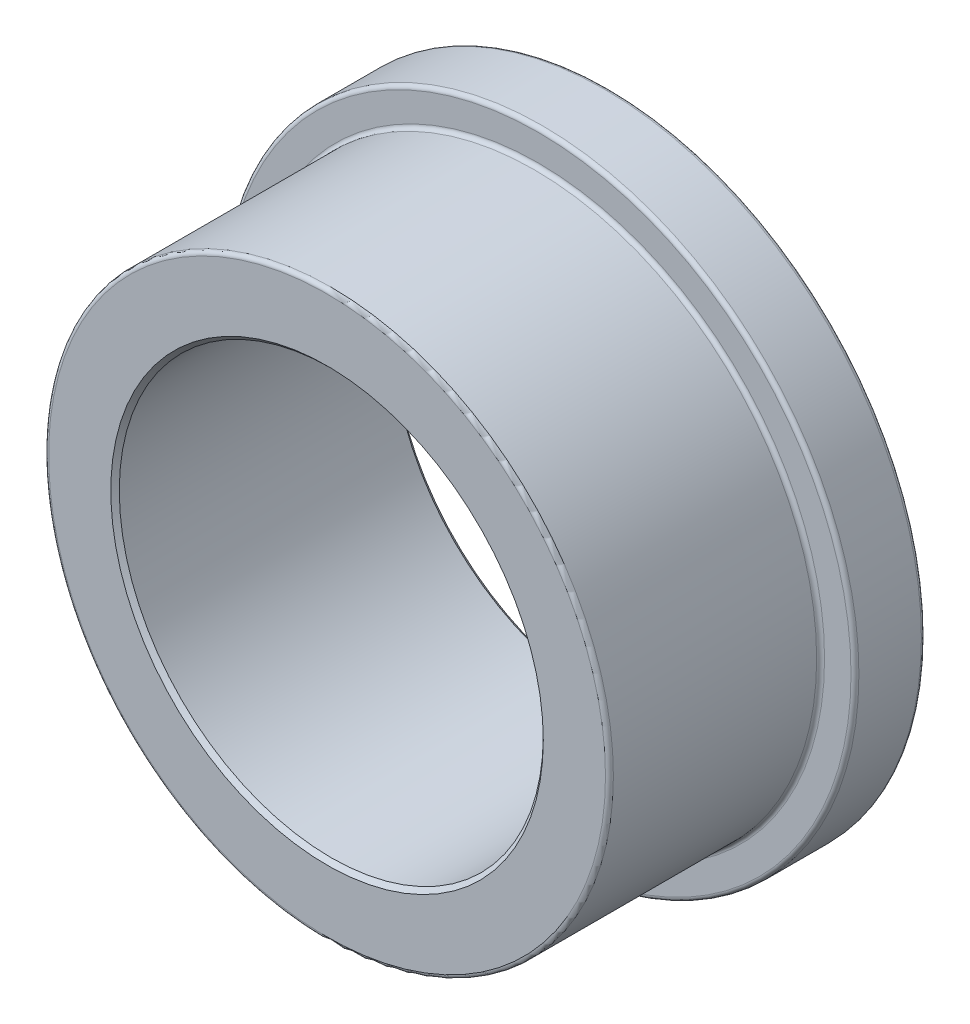
ISO-10303-21;
HEADER;
FILE_DESCRIPTION(('STEP AP214'),'2;1');
FILE_NAME('part.step','',(''),(''),'','','');
FILE_SCHEMA(('AUTOMOTIVE_DESIGN { 1 0 10303 214 1 1 1 1 }'));
ENDSEC;
DATA;
#1=APPLICATION_CONTEXT('core data for automotive mechanical design processes');
#2=APPLICATION_PROTOCOL_DEFINITION('international standard','automotive_design',2000,#1);
#3=PRODUCT_CONTEXT('',#1,'mechanical');
#4=PRODUCT('Part','Part','',(#3));
#5=PRODUCT_RELATED_PRODUCT_CATEGORY('part','',(#4));
#6=PRODUCT_DEFINITION_FORMATION('','',#4);
#7=PRODUCT_DEFINITION_CONTEXT('part definition',#1,'design');
#8=PRODUCT_DEFINITION('design','',#6,#7);
#9=PRODUCT_DEFINITION_SHAPE('','',#8);
#10=(LENGTH_UNIT() NAMED_UNIT(*) SI_UNIT(.MILLI.,.METRE.));
#11=(NAMED_UNIT(*) PLANE_ANGLE_UNIT() SI_UNIT($,.RADIAN.));
#12=(NAMED_UNIT(*) SI_UNIT($,.STERADIAN.) SOLID_ANGLE_UNIT());
#13=UNCERTAINTY_MEASURE_WITH_UNIT(LENGTH_MEASURE(1.E-05),#10,'distance_accuracy_value','');
#14=(GEOMETRIC_REPRESENTATION_CONTEXT(3) GLOBAL_UNCERTAINTY_ASSIGNED_CONTEXT((#13)) GLOBAL_UNIT_ASSIGNED_CONTEXT((#10,
#11,#12)) REPRESENTATION_CONTEXT('',''));
#15=CARTESIAN_POINT('',(0.,0.,0.));
#16=DIRECTION('',(0.,0.,1.));
#17=DIRECTION('',(1.,0.,0.));
#18=AXIS2_PLACEMENT_3D('',#15,#16,#17);
#19=CARTESIAN_POINT('',(0.,0.,12.7));
#20=DIRECTION('',(0.,0.,1.));
#21=DIRECTION('',(1.,0.,0.));
#22=AXIS2_PLACEMENT_3D('',#19,#20,#21);
#23=PLANE('',#22);
#24=CARTESIAN_POINT('',(0.,0.,12.7));
#25=DIRECTION('',(0.,0.,1.));
#26=DIRECTION('',(1.,0.,0.));
#27=AXIS2_PLACEMENT_3D('',#24,#25,#26);
#28=CIRCLE('',#27,12.5597666);
#29=CARTESIAN_POINT('',(12.5597666,0.,12.7));
#30=VERTEX_POINT('',#29);
#31=EDGE_CURVE('E10',#30,#30,#28,.T.);
#32=ORIENTED_EDGE('',*,*,#31,.T.);
#33=EDGE_LOOP('',(#32));
#34=FACE_BOUND('',#33,.T.);
#35=CARTESIAN_POINT('',(0.,0.,12.7));
#36=DIRECTION('',(0.,0.,1.));
#37=DIRECTION('',(1.,0.,0.));
#38=AXIS2_PLACEMENT_3D('',#35,#36,#37);
#39=CIRCLE('',#38,9.754362);
#40=CARTESIAN_POINT('',(9.754362,0.,12.7));
#41=VERTEX_POINT('',#40);
#42=EDGE_CURVE('E67',#41,#41,#39,.F.);
#43=ORIENTED_EDGE('',*,*,#42,.T.);
#44=EDGE_LOOP('',(#43));
#45=FACE_BOUND('',#44,.T.);
#46=ADVANCED_FACE('F35',(#34,#45),#23,.T.);
#47=CARTESIAN_POINT('',(0.,0.,0.));
#48=DIRECTION('',(0.,0.,1.));
#49=DIRECTION('',(1.,0.,0.));
#50=AXIS2_PLACEMENT_3D('',#47,#48,#49);
#51=PLANE('',#50);
#52=CARTESIAN_POINT('',(0.,0.,0.));
#53=DIRECTION('',(0.,0.,1.));
#54=DIRECTION('',(1.,0.,0.));
#55=AXIS2_PLACEMENT_3D('',#52,#53,#54);
#56=CIRCLE('',#55,14.1091666);
#57=CARTESIAN_POINT('',(14.1091666,0.,0.));
#58=VERTEX_POINT('',#57);
#59=EDGE_CURVE('E58',#58,#58,#56,.F.);
#60=ORIENTED_EDGE('',*,*,#59,.T.);
#61=EDGE_LOOP('',(#60));
#62=FACE_BOUND('',#61,.T.);
#63=CARTESIAN_POINT('',(0.,0.,0.));
#64=DIRECTION('',(0.,0.,1.));
#65=DIRECTION('',(1.,0.,0.));
#66=AXIS2_PLACEMENT_3D('',#63,#64,#65);
#67=CIRCLE('',#66,9.754362);
#68=CARTESIAN_POINT('',(9.754362,0.,0.));
#69=VERTEX_POINT('',#68);
#70=EDGE_CURVE('E76',#69,#69,#67,.T.);
#71=ORIENTED_EDGE('',*,*,#70,.T.);
#72=EDGE_LOOP('',(#71));
#73=FACE_BOUND('',#72,.T.);
#74=ADVANCED_FACE('F80',(#62,#73),#51,.F.);
#75=CARTESIAN_POINT('',(0.,0.,12.7));
#76=DIRECTION('',(0.,0.,-1.));
#77=DIRECTION('',(-1.,0.,0.));
#78=AXIS2_PLACEMENT_3D('',#75,#76,#77);
#79=CYLINDRICAL_SURFACE('',#78,12.7381);
#80=CARTESIAN_POINT('',(0.,0.,3.3533334));
#81=DIRECTION('',(0.,0.,1.));
#82=DIRECTION('',(1.,0.,0.));
#83=AXIS2_PLACEMENT_3D('',#80,#81,#82);
#84=CIRCLE('',#83,12.7381);
#85=CARTESIAN_POINT('',(12.7381,0.,3.3533334));
#86=VERTEX_POINT('',#85);
#87=EDGE_CURVE('E42',#86,#86,#84,.T.);
#88=ORIENTED_EDGE('',*,*,#87,.T.);
#89=EDGE_LOOP('',(#88));
#90=FACE_BOUND('',#89,.T.);
#91=CARTESIAN_POINT('',(0.,0.,12.5216666));
#92=DIRECTION('',(0.,0.,1.));
#93=DIRECTION('',(1.,0.,0.));
#94=AXIS2_PLACEMENT_3D('',#91,#92,#93);
#95=CIRCLE('',#94,12.7381);
#96=CARTESIAN_POINT('',(12.7381,0.,12.5216666));
#97=VERTEX_POINT('',#96);
#98=EDGE_CURVE('E46',#97,#97,#95,.F.);
#99=ORIENTED_EDGE('',*,*,#98,.T.);
#100=EDGE_LOOP('',(#99));
#101=FACE_BOUND('',#100,.T.);
#102=ADVANCED_FACE('F105',(#90,#101),#79,.T.);
#103=CARTESIAN_POINT('',(0.,0.,12.7));
#104=DIRECTION('',(0.,0.,-1.));
#105=DIRECTION('',(-1.,0.,0.));
#106=AXIS2_PLACEMENT_3D('',#103,#104,#105);
#107=CYLINDRICAL_SURFACE('',#106,9.5631);
#108=CARTESIAN_POINT('',(0.,0.,0.191261999999999));
#109=DIRECTION('',(0.,0.,1.));
#110=DIRECTION('',(1.,0.,0.));
#111=AXIS2_PLACEMENT_3D('',#108,#109,#110);
#112=CIRCLE('',#111,9.5631);
#113=CARTESIAN_POINT('',(9.5631,0.,0.191261999999999));
#114=VERTEX_POINT('',#113);
#115=EDGE_CURVE('E70',#114,#114,#112,.F.);
#116=ORIENTED_EDGE('',*,*,#115,.T.);
#117=EDGE_LOOP('',(#116));
#118=FACE_BOUND('',#117,.T.);
#119=CARTESIAN_POINT('',(0.,0.,12.508738));
#120=DIRECTION('',(0.,0.,1.));
#121=DIRECTION('',(1.,0.,0.));
#122=AXIS2_PLACEMENT_3D('',#119,#120,#121);
#123=CIRCLE('',#122,9.5631);
#124=CARTESIAN_POINT('',(9.5631,0.,12.508738));
#125=VERTEX_POINT('',#124);
#126=EDGE_CURVE('E73',#125,#125,#123,.T.);
#127=ORIENTED_EDGE('',*,*,#126,.T.);
#128=EDGE_LOOP('',(#127));
#129=FACE_BOUND('',#128,.T.);
#130=ADVANCED_FACE('F110',(#118,#129),#107,.F.);
#131=CARTESIAN_POINT('',(0.,0.,3.175));
#132=DIRECTION('',(0.,0.,1.));
#133=DIRECTION('',(1.,0.,0.));
#134=AXIS2_PLACEMENT_3D('',#131,#132,#133);
#135=PLANE('',#134);
#136=CARTESIAN_POINT('',(0.,0.,3.175));
#137=DIRECTION('',(0.,0.,1.));
#138=DIRECTION('',(1.,0.,0.));
#139=AXIS2_PLACEMENT_3D('',#136,#137,#138);
#140=CIRCLE('',#139,14.1091666);
#141=CARTESIAN_POINT('',(14.1091666,0.,3.175));
#142=VERTEX_POINT('',#141);
#143=EDGE_CURVE('E50',#142,#142,#140,.T.);
#144=ORIENTED_EDGE('',*,*,#143,.T.);
#145=EDGE_LOOP('',(#144));
#146=FACE_BOUND('',#145,.T.);
#147=CARTESIAN_POINT('',(0.,0.,3.175));
#148=DIRECTION('',(0.,0.,1.));
#149=DIRECTION('',(1.,0.,0.));
#150=AXIS2_PLACEMENT_3D('',#147,#148,#149);
#151=CIRCLE('',#150,12.9164334);
#152=CARTESIAN_POINT('',(12.9164334,0.,3.175));
#153=VERTEX_POINT('',#152);
#154=EDGE_CURVE('E55',#153,#153,#151,.F.);
#155=ORIENTED_EDGE('',*,*,#154,.T.);
#156=EDGE_LOOP('',(#155));
#157=FACE_BOUND('',#156,.T.);
#158=ADVANCED_FACE('F95',(#146,#157),#135,.T.);
#159=CARTESIAN_POINT('',(0.,0.,3.175));
#160=DIRECTION('',(0.,0.,-1.));
#161=DIRECTION('',(-1.,0.,0.));
#162=AXIS2_PLACEMENT_3D('',#159,#160,#161);
#163=CYLINDRICAL_SURFACE('',#162,14.2875);
#164=CARTESIAN_POINT('',(0.,0.,0.1783334));
#165=DIRECTION('',(0.,0.,1.));
#166=DIRECTION('',(1.,0.,0.));
#167=AXIS2_PLACEMENT_3D('',#164,#165,#166);
#168=CIRCLE('',#167,14.2875);
#169=CARTESIAN_POINT('',(14.2875,0.,0.1783334));
#170=VERTEX_POINT('',#169);
#171=EDGE_CURVE('E61',#170,#170,#168,.T.);
#172=ORIENTED_EDGE('',*,*,#171,.T.);
#173=EDGE_LOOP('',(#172));
#174=FACE_BOUND('',#173,.T.);
#175=CARTESIAN_POINT('',(0.,0.,2.9966666));
#176=DIRECTION('',(0.,0.,1.));
#177=DIRECTION('',(1.,0.,0.));
#178=AXIS2_PLACEMENT_3D('',#175,#176,#177);
#179=CIRCLE('',#178,14.2875);
#180=CARTESIAN_POINT('',(14.2875,0.,2.9966666));
#181=VERTEX_POINT('',#180);
#182=EDGE_CURVE('E64',#181,#181,#179,.F.);
#183=ORIENTED_EDGE('',*,*,#182,.T.);
#184=EDGE_LOOP('',(#183));
#185=FACE_BOUND('',#184,.T.);
#186=ADVANCED_FACE('F85',(#174,#185),#163,.T.);
#187=CARTESIAN_POINT('',(0.,0.,0.));
#188=DIRECTION('',(0.,0.,-1.));
#189=DIRECTION('',(-1.,0.,0.));
#190=AXIS2_PLACEMENT_3D('',#187,#188,#189);
#191=CONICAL_SURFACE('',#190,9.754362,0.785398163397444);
#192=ORIENTED_EDGE('',*,*,#115,.F.);
#193=EDGE_LOOP('',(#192));
#194=FACE_BOUND('',#193,.T.);
#195=ORIENTED_EDGE('',*,*,#70,.F.);
#196=EDGE_LOOP('',(#195));
#197=FACE_BOUND('',#196,.T.);
#198=ADVANCED_FACE('F82',(#194,#197),#191,.F.);
#199=CARTESIAN_POINT('',(0.,0.,12.508738));
#200=DIRECTION('',(0.,0.,1.));
#201=DIRECTION('',(1.,0.,0.));
#202=AXIS2_PLACEMENT_3D('',#199,#200,#201);
#203=CONICAL_SURFACE('',#202,9.5631,0.785398163397444);
#204=ORIENTED_EDGE('',*,*,#42,.F.);
#205=EDGE_LOOP('',(#204));
#206=FACE_BOUND('',#205,.T.);
#207=ORIENTED_EDGE('',*,*,#126,.F.);
#208=EDGE_LOOP('',(#207));
#209=FACE_BOUND('',#208,.T.);
#210=ADVANCED_FACE('F84',(#206,#209),#203,.F.);
#211=CARTESIAN_POINT('',(0.,0.,0.1783334));
#212=DIRECTION('',(0.,0.,1.));
#213=DIRECTION('',(1.,0.,0.));
#214=AXIS2_PLACEMENT_3D('',#211,#212,#213);
#215=TOROIDAL_SURFACE('',#214,14.1091666,0.1783334);
#216=ORIENTED_EDGE('',*,*,#59,.F.);
#217=EDGE_LOOP('',(#216));
#218=FACE_BOUND('',#217,.T.);
#219=ORIENTED_EDGE('',*,*,#171,.F.);
#220=EDGE_LOOP('',(#219));
#221=FACE_BOUND('',#220,.T.);
#222=ADVANCED_FACE('F92',(#218,#221),#215,.T.);
#223=CARTESIAN_POINT('',(0.,0.,2.9966666));
#224=DIRECTION('',(0.,0.,1.));
#225=DIRECTION('',(1.,0.,0.));
#226=AXIS2_PLACEMENT_3D('',#223,#224,#225);
#227=TOROIDAL_SURFACE('',#226,14.1091666,0.1783334);
#228=ORIENTED_EDGE('',*,*,#182,.F.);
#229=EDGE_LOOP('',(#228));
#230=FACE_BOUND('',#229,.T.);
#231=ORIENTED_EDGE('',*,*,#143,.F.);
#232=EDGE_LOOP('',(#231));
#233=FACE_BOUND('',#232,.T.);
#234=ADVANCED_FACE('F125',(#230,#233),#227,.T.);
#235=CARTESIAN_POINT('',(0.,0.,3.3533334));
#236=DIRECTION('',(0.,0.,1.));
#237=DIRECTION('',(1.,0.,0.));
#238=AXIS2_PLACEMENT_3D('',#235,#236,#237);
#239=TOROIDAL_SURFACE('',#238,12.9164334,0.1783334);
#240=ORIENTED_EDGE('',*,*,#154,.F.);
#241=EDGE_LOOP('',(#240));
#242=FACE_BOUND('',#241,.T.);
#243=ORIENTED_EDGE('',*,*,#87,.F.);
#244=EDGE_LOOP('',(#243));
#245=FACE_BOUND('',#244,.T.);
#246=ADVANCED_FACE('F121',(#242,#245),#239,.F.);
#247=CARTESIAN_POINT('',(0.,0.,12.5216666));
#248=DIRECTION('',(0.,0.,1.));
#249=DIRECTION('',(1.,0.,0.));
#250=AXIS2_PLACEMENT_3D('',#247,#248,#249);
#251=TOROIDAL_SURFACE('',#250,12.5597666,0.1783334);
#252=ORIENTED_EDGE('',*,*,#98,.F.);
#253=EDGE_LOOP('',(#252));
#254=FACE_BOUND('',#253,.T.);
#255=ORIENTED_EDGE('',*,*,#31,.F.);
#256=EDGE_LOOP('',(#255));
#257=FACE_BOUND('',#256,.T.);
#258=ADVANCED_FACE('F37',(#254,#257),#251,.T.);
#259=CLOSED_SHELL('',(#46,#74,#102,#130,#158,#186,#198,#210,#222,#234,#246,#258));
#260=MANIFOLD_SOLID_BREP('B2',#259);
#261=ADVANCED_BREP_SHAPE_REPRESENTATION('',(#18,#260),#14);
#262=SHAPE_DEFINITION_REPRESENTATION(#9,#261);
ENDSEC;
END-ISO-10303-21;
